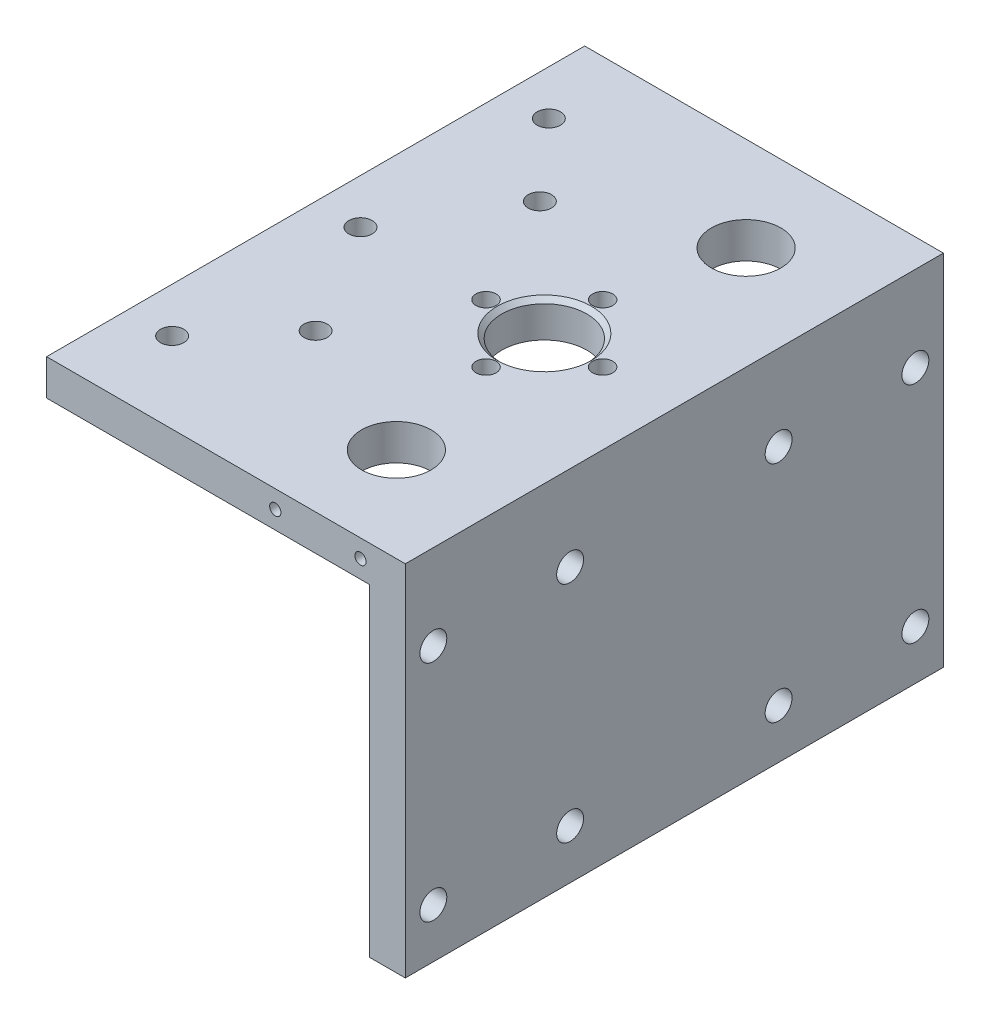
ISO-10303-21;
HEADER;
FILE_DESCRIPTION(('STEP AP214'),'2;1');
FILE_NAME('part.step','',(''),(''),'','','');
FILE_SCHEMA(('AUTOMOTIVE_DESIGN { 1 0 10303 214 1 1 1 1 }'));
ENDSEC;
DATA;
#1=APPLICATION_CONTEXT('core data for automotive mechanical design processes');
#2=APPLICATION_PROTOCOL_DEFINITION('international standard','automotive_design',2000,#1);
#3=PRODUCT_CONTEXT('',#1,'mechanical');
#4=PRODUCT('Part','Part','',(#3));
#5=PRODUCT_RELATED_PRODUCT_CATEGORY('part','',(#4));
#6=PRODUCT_DEFINITION_FORMATION('','',#4);
#7=PRODUCT_DEFINITION_CONTEXT('part definition',#1,'design');
#8=PRODUCT_DEFINITION('design','',#6,#7);
#9=PRODUCT_DEFINITION_SHAPE('','',#8);
#10=(LENGTH_UNIT() NAMED_UNIT(*) SI_UNIT(.MILLI.,.METRE.));
#11=(NAMED_UNIT(*) PLANE_ANGLE_UNIT() SI_UNIT($,.RADIAN.));
#12=(NAMED_UNIT(*) SI_UNIT($,.STERADIAN.) SOLID_ANGLE_UNIT());
#13=UNCERTAINTY_MEASURE_WITH_UNIT(LENGTH_MEASURE(1.E-05),#10,'distance_accuracy_value','');
#14=(GEOMETRIC_REPRESENTATION_CONTEXT(3) GLOBAL_UNCERTAINTY_ASSIGNED_CONTEXT((#13)) GLOBAL_UNIT_ASSIGNED_CONTEXT((#10,
#11,#12)) REPRESENTATION_CONTEXT('',''));
#15=CARTESIAN_POINT('',(0.,0.,0.));
#16=DIRECTION('',(0.,0.,1.));
#17=DIRECTION('',(1.,0.,0.));
#18=AXIS2_PLACEMENT_3D('',#15,#16,#17);
#19=CARTESIAN_POINT('',(0.,-80.,120.));
#20=DIRECTION('',(-1.,0.,0.));
#21=DIRECTION('',(0.,0.,1.));
#22=AXIS2_PLACEMENT_3D('',#19,#20,#21);
#23=PLANE('',#22);
#24=CARTESIAN_POINT('',(0.,-69.,36.75));
#25=DIRECTION('',(1.,0.,0.));
#26=DIRECTION('',(0.,0.,1.));
#27=AXIS2_PLACEMENT_3D('',#24,#25,#26);
#28=CIRCLE('',#27,3.);
#29=CARTESIAN_POINT('',(0.,-69.,39.75));
#30=VERTEX_POINT('',#29);
#31=EDGE_CURVE('E178',#30,#30,#28,.T.);
#32=ORIENTED_EDGE('',*,*,#31,.F.);
#33=EDGE_LOOP('',(#32));
#34=FACE_BOUND('',#33,.T.);
#35=CARTESIAN_POINT('',(0.,-69.,6.25));
#36=DIRECTION('',(1.,0.,0.));
#37=DIRECTION('',(0.,0.,-1.));
#38=AXIS2_PLACEMENT_3D('',#35,#36,#37);
#39=CIRCLE('',#38,3.);
#40=CARTESIAN_POINT('',(0.,-69.,3.25));
#41=VERTEX_POINT('',#40);
#42=EDGE_CURVE('E174',#41,#41,#39,.T.);
#43=ORIENTED_EDGE('',*,*,#42,.F.);
#44=EDGE_LOOP('',(#43));
#45=FACE_BOUND('',#44,.T.);
#46=CARTESIAN_POINT('',(0.,-69.,113.75));
#47=DIRECTION('',(1.,0.,0.));
#48=DIRECTION('',(0.,0.,1.));
#49=AXIS2_PLACEMENT_3D('',#46,#47,#48);
#50=CIRCLE('',#49,3.00000000000001);
#51=CARTESIAN_POINT('',(0.,-69.,116.75));
#52=VERTEX_POINT('',#51);
#53=EDGE_CURVE('E170',#52,#52,#50,.T.);
#54=ORIENTED_EDGE('',*,*,#53,.F.);
#55=EDGE_LOOP('',(#54));
#56=FACE_BOUND('',#55,.T.);
#57=CARTESIAN_POINT('',(0.,-69.,83.25));
#58=DIRECTION('',(1.,0.,0.));
#59=DIRECTION('',(0.,0.,-1.));
#60=AXIS2_PLACEMENT_3D('',#57,#58,#59);
#61=CIRCLE('',#60,3.00000000000001);
#62=CARTESIAN_POINT('',(0.,-69.,80.25));
#63=VERTEX_POINT('',#62);
#64=EDGE_CURVE('E166',#63,#63,#61,.T.);
#65=ORIENTED_EDGE('',*,*,#64,.F.);
#66=EDGE_LOOP('',(#65));
#67=FACE_BOUND('',#66,.T.);
#68=CARTESIAN_POINT('',(0.,-19.,6.25));
#69=DIRECTION('',(1.,0.,0.));
#70=DIRECTION('',(0.,0.,1.));
#71=AXIS2_PLACEMENT_3D('',#68,#69,#70);
#72=CIRCLE('',#71,3.);
#73=CARTESIAN_POINT('',(0.,-19.,9.25));
#74=VERTEX_POINT('',#73);
#75=EDGE_CURVE('E162',#74,#74,#72,.T.);
#76=ORIENTED_EDGE('',*,*,#75,.F.);
#77=EDGE_LOOP('',(#76));
#78=FACE_BOUND('',#77,.T.);
#79=CARTESIAN_POINT('',(0.,-19.,36.75));
#80=DIRECTION('',(1.,0.,0.));
#81=DIRECTION('',(0.,0.,-1.));
#82=AXIS2_PLACEMENT_3D('',#79,#80,#81);
#83=CIRCLE('',#82,3.);
#84=CARTESIAN_POINT('',(0.,-19.,33.75));
#85=VERTEX_POINT('',#84);
#86=EDGE_CURVE('E158',#85,#85,#83,.T.);
#87=ORIENTED_EDGE('',*,*,#86,.F.);
#88=EDGE_LOOP('',(#87));
#89=FACE_BOUND('',#88,.T.);
#90=CARTESIAN_POINT('',(0.,-19.,113.75));
#91=DIRECTION('',(1.,0.,0.));
#92=DIRECTION('',(0.,0.,-1.));
#93=AXIS2_PLACEMENT_3D('',#90,#91,#92);
#94=CIRCLE('',#93,3.00000000000001);
#95=CARTESIAN_POINT('',(0.,-19.,110.75));
#96=VERTEX_POINT('',#95);
#97=EDGE_CURVE('E154',#96,#96,#94,.T.);
#98=ORIENTED_EDGE('',*,*,#97,.F.);
#99=EDGE_LOOP('',(#98));
#100=FACE_BOUND('',#99,.T.);
#101=CARTESIAN_POINT('',(0.,-19.,83.25));
#102=DIRECTION('',(1.,0.,0.));
#103=DIRECTION('',(0.,0.,1.));
#104=AXIS2_PLACEMENT_3D('',#101,#102,#103);
#105=CIRCLE('',#104,3.00000000000001);
#106=CARTESIAN_POINT('',(0.,-19.,86.25));
#107=VERTEX_POINT('',#106);
#108=EDGE_CURVE('E150',#107,#107,#105,.T.);
#109=ORIENTED_EDGE('',*,*,#108,.F.);
#110=EDGE_LOOP('',(#109));
#111=FACE_BOUND('',#110,.T.);
#112=DIRECTION('',(0.,1.,0.));
#113=VECTOR('',#112,1.);
#114=CARTESIAN_POINT('',(0.,-80.,0.));
#115=LINE('',#114,#113);
#116=CARTESIAN_POINT('',(0.,-80.,0.));
#117=VERTEX_POINT('',#116);
#118=CARTESIAN_POINT('',(0.,0.,0.));
#119=VERTEX_POINT('',#118);
#120=EDGE_CURVE('E126',#117,#119,#115,.T.);
#121=ORIENTED_EDGE('',*,*,#120,.T.);
#122=DIRECTION('',(0.,0.,-1.));
#123=VECTOR('',#122,1.);
#124=CARTESIAN_POINT('',(0.,0.,120.));
#125=LINE('',#124,#123);
#126=CARTESIAN_POINT('',(0.,0.,120.));
#127=VERTEX_POINT('',#126);
#128=EDGE_CURVE('E144',#127,#119,#125,.T.);
#129=ORIENTED_EDGE('',*,*,#128,.F.);
#130=DIRECTION('',(0.,1.,0.));
#131=VECTOR('',#130,1.);
#132=CARTESIAN_POINT('',(0.,-80.,120.));
#133=LINE('',#132,#131);
#134=CARTESIAN_POINT('',(0.,-80.,120.));
#135=VERTEX_POINT('',#134);
#136=EDGE_CURVE('E137',#135,#127,#133,.T.);
#137=ORIENTED_EDGE('',*,*,#136,.F.);
#138=DIRECTION('',(0.,0.,-1.));
#139=VECTOR('',#138,1.);
#140=CARTESIAN_POINT('',(0.,-80.,120.));
#141=LINE('',#140,#139);
#142=EDGE_CURVE('E122',#135,#117,#141,.T.);
#143=ORIENTED_EDGE('',*,*,#142,.T.);
#144=EDGE_LOOP('',(#121,#129,#137,#143));
#145=FACE_BOUND('',#144,.T.);
#146=ADVANCED_FACE('F37',(#34,#45,#56,#67,#78,#89,#100,#111,#145),#23,.F.);
#147=CARTESIAN_POINT('',(0.,0.,120.));
#148=DIRECTION('',(0.,-1.,0.));
#149=DIRECTION('',(1.,0.,0.));
#150=AXIS2_PLACEMENT_3D('',#147,#148,#149);
#151=PLANE('',#150);
#152=CARTESIAN_POINT('',(-29.,0.,60.));
#153=DIRECTION('',(0.,-1.,0.));
#154=DIRECTION('',(1.,0.,0.));
#155=AXIS2_PLACEMENT_3D('',#152,#153,#154);
#156=CIRCLE('',#155,10.5);
#157=CARTESIAN_POINT('',(-18.5,0.,60.));
#158=VERTEX_POINT('',#157);
#159=EDGE_CURVE('E11',#158,#158,#156,.T.);
#160=ORIENTED_EDGE('',*,*,#159,.T.);
#161=EDGE_LOOP('',(#160));
#162=FACE_BOUND('',#161,.T.);
#163=CARTESIAN_POINT('',(-55.,0.,85.));
#164=DIRECTION('',(0.,1.,0.));
#165=DIRECTION('',(-1.,0.,0.));
#166=AXIS2_PLACEMENT_3D('',#163,#164,#165);
#167=CIRCLE('',#166,2.6);
#168=CARTESIAN_POINT('',(-57.6,0.,85.));
#169=VERTEX_POINT('',#168);
#170=EDGE_CURVE('E197',#169,#169,#167,.T.);
#171=ORIENTED_EDGE('',*,*,#170,.F.);
#172=EDGE_LOOP('',(#171));
#173=FACE_BOUND('',#172,.T.);
#174=CARTESIAN_POINT('',(-55.,0.,35.));
#175=DIRECTION('',(0.,1.,0.));
#176=DIRECTION('',(-1.,0.,0.));
#177=AXIS2_PLACEMENT_3D('',#174,#175,#176);
#178=CIRCLE('',#177,2.6);
#179=CARTESIAN_POINT('',(-57.6,0.,35.));
#180=VERTEX_POINT('',#179);
#181=EDGE_CURVE('E194',#180,#180,#178,.T.);
#182=ORIENTED_EDGE('',*,*,#181,.F.);
#183=EDGE_LOOP('',(#182));
#184=FACE_BOUND('',#183,.T.);
#185=CARTESIAN_POINT('',(-70.,0.,102.));
#186=DIRECTION('',(0.,1.,0.));
#187=DIRECTION('',(-1.,0.,0.));
#188=AXIS2_PLACEMENT_3D('',#185,#186,#187);
#189=CIRCLE('',#188,2.6);
#190=CARTESIAN_POINT('',(-72.6,0.,102.));
#191=VERTEX_POINT('',#190);
#192=EDGE_CURVE('E190',#191,#191,#189,.T.);
#193=ORIENTED_EDGE('',*,*,#192,.F.);
#194=EDGE_LOOP('',(#193));
#195=FACE_BOUND('',#194,.T.);
#196=CARTESIAN_POINT('',(-70.,0.,60.));
#197=DIRECTION('',(0.,1.,0.));
#198=DIRECTION('',(-1.,0.,0.));
#199=AXIS2_PLACEMENT_3D('',#196,#197,#198);
#200=CIRCLE('',#199,2.6);
#201=CARTESIAN_POINT('',(-72.6,0.,60.));
#202=VERTEX_POINT('',#201);
#203=EDGE_CURVE('E186',#202,#202,#200,.T.);
#204=ORIENTED_EDGE('',*,*,#203,.F.);
#205=EDGE_LOOP('',(#204));
#206=FACE_BOUND('',#205,.T.);
#207=CARTESIAN_POINT('',(-70.,0.,18.));
#208=DIRECTION('',(0.,1.,0.));
#209=DIRECTION('',(-1.,0.,0.));
#210=AXIS2_PLACEMENT_3D('',#207,#208,#209);
#211=CIRCLE('',#210,2.6);
#212=CARTESIAN_POINT('',(-72.6,0.,18.));
#213=VERTEX_POINT('',#212);
#214=EDGE_CURVE('E182',#213,#213,#211,.T.);
#215=ORIENTED_EDGE('',*,*,#214,.F.);
#216=EDGE_LOOP('',(#215));
#217=FACE_BOUND('',#216,.T.);
#218=CARTESIAN_POINT('',(-29.,0.,47.));
#219=DIRECTION('',(0.,1.,0.));
#220=DIRECTION('',(0.,0.,1.));
#221=AXIS2_PLACEMENT_3D('',#218,#219,#220);
#222=CIRCLE('',#221,2.24999999999999);
#223=CARTESIAN_POINT('',(-29.,0.,49.25));
#224=VERTEX_POINT('',#223);
#225=EDGE_CURVE('E149',#224,#224,#222,.T.);
#226=ORIENTED_EDGE('',*,*,#225,.F.);
#227=EDGE_LOOP('',(#226));
#228=FACE_BOUND('',#227,.T.);
#229=CARTESIAN_POINT('',(-42.,0.,60.));
#230=DIRECTION('',(0.,1.,0.));
#231=DIRECTION('',(0.,0.,1.));
#232=AXIS2_PLACEMENT_3D('',#229,#230,#231);
#233=CIRCLE('',#232,2.24999999999999);
#234=CARTESIAN_POINT('',(-42.,0.,62.25));
#235=VERTEX_POINT('',#234);
#236=EDGE_CURVE('E382',#235,#235,#233,.T.);
#237=ORIENTED_EDGE('',*,*,#236,.F.);
#238=EDGE_LOOP('',(#237));
#239=FACE_BOUND('',#238,.T.);
#240=CARTESIAN_POINT('',(-29.,0.,73.));
#241=DIRECTION('',(0.,1.,0.));
#242=DIRECTION('',(0.,0.,1.));
#243=AXIS2_PLACEMENT_3D('',#240,#241,#242);
#244=CIRCLE('',#243,2.24999999999999);
#245=CARTESIAN_POINT('',(-29.,0.,75.25));
#246=VERTEX_POINT('',#245);
#247=EDGE_CURVE('E388',#246,#246,#244,.T.);
#248=ORIENTED_EDGE('',*,*,#247,.F.);
#249=EDGE_LOOP('',(#248));
#250=FACE_BOUND('',#249,.T.);
#251=CARTESIAN_POINT('',(-16.,0.,60.));
#252=DIRECTION('',(0.,1.,0.));
#253=DIRECTION('',(0.,0.,1.));
#254=AXIS2_PLACEMENT_3D('',#251,#252,#253);
#255=CIRCLE('',#254,2.24999999999999);
#256=CARTESIAN_POINT('',(-16.,0.,62.25));
#257=VERTEX_POINT('',#256);
#258=EDGE_CURVE('E394',#257,#257,#255,.T.);
#259=ORIENTED_EDGE('',*,*,#258,.F.);
#260=EDGE_LOOP('',(#259));
#261=FACE_BOUND('',#260,.T.);
#262=CARTESIAN_POINT('',(-23.,0.,99.));
#263=DIRECTION('',(0.,1.,0.));
#264=DIRECTION('',(-1.,0.,0.));
#265=AXIS2_PLACEMENT_3D('',#262,#263,#264);
#266=CIRCLE('',#265,7.75000000000001);
#267=CARTESIAN_POINT('',(-30.75,0.,99.));
#268=VERTEX_POINT('',#267);
#269=EDGE_CURVE('E403',#268,#268,#266,.T.);
#270=ORIENTED_EDGE('',*,*,#269,.F.);
#271=EDGE_LOOP('',(#270));
#272=FACE_BOUND('',#271,.T.);
#273=CARTESIAN_POINT('',(-23.,0.,21.));
#274=DIRECTION('',(0.,1.,0.));
#275=DIRECTION('',(-1.,0.,0.));
#276=AXIS2_PLACEMENT_3D('',#273,#274,#275);
#277=CIRCLE('',#276,7.75);
#278=CARTESIAN_POINT('',(-30.75,0.,21.));
#279=VERTEX_POINT('',#278);
#280=EDGE_CURVE('E409',#279,#279,#277,.T.);
#281=ORIENTED_EDGE('',*,*,#280,.F.);
#282=EDGE_LOOP('',(#281));
#283=FACE_BOUND('',#282,.T.);
#284=DIRECTION('',(-1.,0.,0.));
#285=VECTOR('',#284,1.);
#286=CARTESIAN_POINT('',(0.,0.,0.));
#287=LINE('',#286,#285);
#288=CARTESIAN_POINT('',(-80.,0.,0.));
#289=VERTEX_POINT('',#288);
#290=EDGE_CURVE('E129',#119,#289,#287,.T.);
#291=ORIENTED_EDGE('',*,*,#290,.T.);
#292=DIRECTION('',(0.,0.,-1.));
#293=VECTOR('',#292,1.);
#294=CARTESIAN_POINT('',(-80.,0.,120.));
#295=LINE('',#294,#293);
#296=CARTESIAN_POINT('',(-80.,0.,120.));
#297=VERTEX_POINT('',#296);
#298=EDGE_CURVE('E141',#297,#289,#295,.T.);
#299=ORIENTED_EDGE('',*,*,#298,.F.);
#300=DIRECTION('',(-1.,0.,0.));
#301=VECTOR('',#300,1.);
#302=CARTESIAN_POINT('',(0.,0.,120.));
#303=LINE('',#302,#301);
#304=EDGE_CURVE('E93',#127,#297,#303,.T.);
#305=ORIENTED_EDGE('',*,*,#304,.F.);
#306=ORIENTED_EDGE('',*,*,#128,.T.);
#307=EDGE_LOOP('',(#291,#299,#305,#306));
#308=FACE_BOUND('',#307,.T.);
#309=ADVANCED_FACE('F220',(#162,#173,#184,#195,#206,#217,#228,#239,#250,#261,#272,#283,#308),
#151,.F.);
#310=CARTESIAN_POINT('',(-80.,0.,120.));
#311=DIRECTION('',(1.,0.,0.));
#312=DIRECTION('',(0.,0.,-1.));
#313=AXIS2_PLACEMENT_3D('',#310,#311,#312);
#314=PLANE('',#313);
#315=DIRECTION('',(0.,-1.,0.));
#316=VECTOR('',#315,1.);
#317=CARTESIAN_POINT('',(-80.,0.,0.));
#318=LINE('',#317,#316);
#319=CARTESIAN_POINT('',(-80.,-8.00000000000001,0.));
#320=VERTEX_POINT('',#319);
#321=EDGE_CURVE('E132',#289,#320,#318,.T.);
#322=ORIENTED_EDGE('',*,*,#321,.T.);
#323=DIRECTION('',(0.,0.,-1.));
#324=VECTOR('',#323,1.);
#325=CARTESIAN_POINT('',(-80.,-8.00000000000001,120.));
#326=LINE('',#325,#324);
#327=CARTESIAN_POINT('',(-80.,-8.00000000000001,120.));
#328=VERTEX_POINT('',#327);
#329=EDGE_CURVE('E117',#328,#320,#326,.T.);
#330=ORIENTED_EDGE('',*,*,#329,.F.);
#331=DIRECTION('',(0.,-1.,0.));
#332=VECTOR('',#331,1.);
#333=CARTESIAN_POINT('',(-80.,0.,120.));
#334=LINE('',#333,#332);
#335=EDGE_CURVE('E108',#297,#328,#334,.T.);
#336=ORIENTED_EDGE('',*,*,#335,.F.);
#337=ORIENTED_EDGE('',*,*,#298,.T.);
#338=EDGE_LOOP('',(#322,#330,#336,#337));
#339=FACE_BOUND('',#338,.T.);
#340=ADVANCED_FACE('F225',(#339),#314,.F.);
#341=CARTESIAN_POINT('',(-80.,-8.00000000000001,120.));
#342=DIRECTION('',(0.,1.,0.));
#343=DIRECTION('',(0.,0.,1.));
#344=AXIS2_PLACEMENT_3D('',#341,#342,#343);
#345=PLANE('',#344);
#346=CARTESIAN_POINT('',(-55.,-8.00000000000001,85.));
#347=DIRECTION('',(0.,1.,0.));
#348=DIRECTION('',(0.,0.,1.));
#349=AXIS2_PLACEMENT_3D('',#346,#347,#348);
#350=CIRCLE('',#349,2.6);
#351=CARTESIAN_POINT('',(-55.,-8.00000000000001,87.6));
#352=VERTEX_POINT('',#351);
#353=EDGE_CURVE('E195',#352,#352,#350,.T.);
#354=ORIENTED_EDGE('',*,*,#353,.T.);
#355=EDGE_LOOP('',(#354));
#356=FACE_BOUND('',#355,.T.);
#357=CARTESIAN_POINT('',(-55.,-8.00000000000001,35.));
#358=DIRECTION('',(0.,1.,0.));
#359=DIRECTION('',(0.,0.,1.));
#360=AXIS2_PLACEMENT_3D('',#357,#358,#359);
#361=CIRCLE('',#360,2.6);
#362=CARTESIAN_POINT('',(-55.,-8.00000000000001,37.6));
#363=VERTEX_POINT('',#362);
#364=EDGE_CURVE('E191',#363,#363,#361,.T.);
#365=ORIENTED_EDGE('',*,*,#364,.T.);
#366=EDGE_LOOP('',(#365));
#367=FACE_BOUND('',#366,.T.);
#368=CARTESIAN_POINT('',(-70.,-8.00000000000001,102.));
#369=DIRECTION('',(0.,1.,0.));
#370=DIRECTION('',(0.,0.,1.));
#371=AXIS2_PLACEMENT_3D('',#368,#369,#370);
#372=CIRCLE('',#371,2.6);
#373=CARTESIAN_POINT('',(-70.,-8.00000000000001,104.6));
#374=VERTEX_POINT('',#373);
#375=EDGE_CURVE('E187',#374,#374,#372,.T.);
#376=ORIENTED_EDGE('',*,*,#375,.T.);
#377=EDGE_LOOP('',(#376));
#378=FACE_BOUND('',#377,.T.);
#379=CARTESIAN_POINT('',(-70.,-8.00000000000001,60.));
#380=DIRECTION('',(0.,1.,0.));
#381=DIRECTION('',(0.,0.,1.));
#382=AXIS2_PLACEMENT_3D('',#379,#380,#381);
#383=CIRCLE('',#382,2.6);
#384=CARTESIAN_POINT('',(-70.,-8.00000000000001,62.6));
#385=VERTEX_POINT('',#384);
#386=EDGE_CURVE('E183',#385,#385,#383,.T.);
#387=ORIENTED_EDGE('',*,*,#386,.T.);
#388=EDGE_LOOP('',(#387));
#389=FACE_BOUND('',#388,.T.);
#390=CARTESIAN_POINT('',(-70.,-8.00000000000001,18.));
#391=DIRECTION('',(0.,1.,0.));
#392=DIRECTION('',(0.,0.,1.));
#393=AXIS2_PLACEMENT_3D('',#390,#391,#392);
#394=CIRCLE('',#393,2.6);
#395=CARTESIAN_POINT('',(-70.,-8.00000000000001,20.6));
#396=VERTEX_POINT('',#395);
#397=EDGE_CURVE('E179',#396,#396,#394,.T.);
#398=ORIENTED_EDGE('',*,*,#397,.T.);
#399=EDGE_LOOP('',(#398));
#400=FACE_BOUND('',#399,.T.);
#401=CARTESIAN_POINT('',(-29.,-8.00000000000001,47.));
#402=DIRECTION('',(0.,1.,0.));
#403=DIRECTION('',(0.,0.,1.));
#404=AXIS2_PLACEMENT_3D('',#401,#402,#403);
#405=CIRCLE('',#404,2.24999999999999);
#406=CARTESIAN_POINT('',(-29.,-8.00000000000001,49.25));
#407=VERTEX_POINT('',#406);
#408=EDGE_CURVE('E379',#407,#407,#405,.T.);
#409=ORIENTED_EDGE('',*,*,#408,.T.);
#410=EDGE_LOOP('',(#409));
#411=FACE_BOUND('',#410,.T.);
#412=CARTESIAN_POINT('',(-42.,-8.00000000000001,60.));
#413=DIRECTION('',(0.,1.,0.));
#414=DIRECTION('',(0.,0.,1.));
#415=AXIS2_PLACEMENT_3D('',#412,#413,#414);
#416=CIRCLE('',#415,2.24999999999999);
#417=CARTESIAN_POINT('',(-42.,-8.00000000000001,62.25));
#418=VERTEX_POINT('',#417);
#419=EDGE_CURVE('E385',#418,#418,#416,.T.);
#420=ORIENTED_EDGE('',*,*,#419,.T.);
#421=EDGE_LOOP('',(#420));
#422=FACE_BOUND('',#421,.T.);
#423=CARTESIAN_POINT('',(-29.,-8.00000000000001,73.));
#424=DIRECTION('',(0.,1.,0.));
#425=DIRECTION('',(0.,0.,1.));
#426=AXIS2_PLACEMENT_3D('',#423,#424,#425);
#427=CIRCLE('',#426,2.24999999999999);
#428=CARTESIAN_POINT('',(-29.,-8.00000000000001,75.25));
#429=VERTEX_POINT('',#428);
#430=EDGE_CURVE('E391',#429,#429,#427,.T.);
#431=ORIENTED_EDGE('',*,*,#430,.T.);
#432=EDGE_LOOP('',(#431));
#433=FACE_BOUND('',#432,.T.);
#434=CARTESIAN_POINT('',(-16.,-8.00000000000001,60.));
#435=DIRECTION('',(0.,1.,0.));
#436=DIRECTION('',(0.,0.,1.));
#437=AXIS2_PLACEMENT_3D('',#434,#435,#436);
#438=CIRCLE('',#437,2.24999999999999);
#439=CARTESIAN_POINT('',(-16.,-8.00000000000001,62.25));
#440=VERTEX_POINT('',#439);
#441=EDGE_CURVE('E397',#440,#440,#438,.T.);
#442=ORIENTED_EDGE('',*,*,#441,.T.);
#443=EDGE_LOOP('',(#442));
#444=FACE_BOUND('',#443,.T.);
#445=CARTESIAN_POINT('',(-29.,-8.00000000000001,60.));
#446=DIRECTION('',(0.,1.,0.));
#447=DIRECTION('',(0.,0.,1.));
#448=AXIS2_PLACEMENT_3D('',#445,#446,#447);
#449=CIRCLE('',#448,9.5);
#450=CARTESIAN_POINT('',(-29.,-8.00000000000001,69.5));
#451=VERTEX_POINT('',#450);
#452=EDGE_CURVE('E400',#451,#451,#449,.F.);
#453=ORIENTED_EDGE('',*,*,#452,.F.);
#454=EDGE_LOOP('',(#453));
#455=FACE_BOUND('',#454,.T.);
#456=CARTESIAN_POINT('',(-23.,-8.00000000000001,99.));
#457=DIRECTION('',(0.,1.,0.));
#458=DIRECTION('',(0.,0.,1.));
#459=AXIS2_PLACEMENT_3D('',#456,#457,#458);
#460=CIRCLE('',#459,7.75000000000001);
#461=CARTESIAN_POINT('',(-23.,-8.00000000000001,106.75));
#462=VERTEX_POINT('',#461);
#463=EDGE_CURVE('E406',#462,#462,#460,.F.);
#464=ORIENTED_EDGE('',*,*,#463,.F.);
#465=EDGE_LOOP('',(#464));
#466=FACE_BOUND('',#465,.T.);
#467=CARTESIAN_POINT('',(-23.,-8.00000000000001,21.));
#468=DIRECTION('',(0.,1.,0.));
#469=DIRECTION('',(0.,0.,1.));
#470=AXIS2_PLACEMENT_3D('',#467,#468,#469);
#471=CIRCLE('',#470,7.75);
#472=CARTESIAN_POINT('',(-23.,-8.00000000000001,28.75));
#473=VERTEX_POINT('',#472);
#474=EDGE_CURVE('E130',#473,#473,#471,.F.);
#475=ORIENTED_EDGE('',*,*,#474,.F.);
#476=EDGE_LOOP('',(#475));
#477=FACE_BOUND('',#476,.T.);
#478=DIRECTION('',(1.,0.,0.));
#479=VECTOR('',#478,1.);
#480=CARTESIAN_POINT('',(-80.,-8.00000000000001,0.));
#481=LINE('',#480,#479);
#482=CARTESIAN_POINT('',(-8.00000000000001,-8.00000000000001,0.));
#483=VERTEX_POINT('',#482);
#484=EDGE_CURVE('E116',#320,#483,#481,.T.);
#485=ORIENTED_EDGE('',*,*,#484,.T.);
#486=DIRECTION('',(0.,0.,-1.));
#487=VECTOR('',#486,1.);
#488=CARTESIAN_POINT('',(-8.00000000000001,-8.00000000000001,120.));
#489=LINE('',#488,#487);
#490=CARTESIAN_POINT('',(-8.00000000000001,-8.00000000000001,120.));
#491=VERTEX_POINT('',#490);
#492=EDGE_CURVE('E113',#491,#483,#489,.T.);
#493=ORIENTED_EDGE('',*,*,#492,.F.);
#494=DIRECTION('',(1.,0.,0.));
#495=VECTOR('',#494,1.);
#496=CARTESIAN_POINT('',(-80.,-8.00000000000001,120.));
#497=LINE('',#496,#495);
#498=EDGE_CURVE('E102',#328,#491,#497,.T.);
#499=ORIENTED_EDGE('',*,*,#498,.F.);
#500=ORIENTED_EDGE('',*,*,#329,.T.);
#501=EDGE_LOOP('',(#485,#493,#499,#500));
#502=FACE_BOUND('',#501,.T.);
#503=ADVANCED_FACE('F114',(#356,#367,#378,#389,#400,#411,#422,#433,#444,#455,#466,#477,#502),
#345,.F.);
#504=CARTESIAN_POINT('',(-8.00000000000001,-8.00000000000001,120.));
#505=DIRECTION('',(1.,0.,0.));
#506=DIRECTION('',(0.,1.,0.));
#507=AXIS2_PLACEMENT_3D('',#504,#505,#506);
#508=PLANE('',#507);
#509=CARTESIAN_POINT('',(-8.,-69.,36.75));
#510=DIRECTION('',(1.,0.,0.));
#511=DIRECTION('',(0.,1.,0.));
#512=AXIS2_PLACEMENT_3D('',#509,#510,#511);
#513=CIRCLE('',#512,3.);
#514=CARTESIAN_POINT('',(-8.,-66.,36.75));
#515=VERTEX_POINT('',#514);
#516=EDGE_CURVE('E175',#515,#515,#513,.T.);
#517=ORIENTED_EDGE('',*,*,#516,.T.);
#518=EDGE_LOOP('',(#517));
#519=FACE_BOUND('',#518,.T.);
#520=CARTESIAN_POINT('',(-8.,-69.,6.25));
#521=DIRECTION('',(1.,0.,0.));
#522=DIRECTION('',(0.,1.,0.));
#523=AXIS2_PLACEMENT_3D('',#520,#521,#522);
#524=CIRCLE('',#523,3.);
#525=CARTESIAN_POINT('',(-8.,-66.,6.25));
#526=VERTEX_POINT('',#525);
#527=EDGE_CURVE('E171',#526,#526,#524,.T.);
#528=ORIENTED_EDGE('',*,*,#527,.T.);
#529=EDGE_LOOP('',(#528));
#530=FACE_BOUND('',#529,.T.);
#531=CARTESIAN_POINT('',(-8.,-69.,113.75));
#532=DIRECTION('',(1.,0.,0.));
#533=DIRECTION('',(0.,1.,0.));
#534=AXIS2_PLACEMENT_3D('',#531,#532,#533);
#535=CIRCLE('',#534,3.00000000000001);
#536=CARTESIAN_POINT('',(-8.,-66.,113.75));
#537=VERTEX_POINT('',#536);
#538=EDGE_CURVE('E167',#537,#537,#535,.T.);
#539=ORIENTED_EDGE('',*,*,#538,.T.);
#540=EDGE_LOOP('',(#539));
#541=FACE_BOUND('',#540,.T.);
#542=CARTESIAN_POINT('',(-8.,-69.,83.25));
#543=DIRECTION('',(1.,0.,0.));
#544=DIRECTION('',(0.,1.,0.));
#545=AXIS2_PLACEMENT_3D('',#542,#543,#544);
#546=CIRCLE('',#545,3.00000000000001);
#547=CARTESIAN_POINT('',(-8.,-66.,83.25));
#548=VERTEX_POINT('',#547);
#549=EDGE_CURVE('E163',#548,#548,#546,.T.);
#550=ORIENTED_EDGE('',*,*,#549,.T.);
#551=EDGE_LOOP('',(#550));
#552=FACE_BOUND('',#551,.T.);
#553=CARTESIAN_POINT('',(-8.00000000000001,-19.,6.25));
#554=DIRECTION('',(1.,0.,0.));
#555=DIRECTION('',(0.,1.,0.));
#556=AXIS2_PLACEMENT_3D('',#553,#554,#555);
#557=CIRCLE('',#556,3.);
#558=CARTESIAN_POINT('',(-8.00000000000001,-16.,6.25));
#559=VERTEX_POINT('',#558);
#560=EDGE_CURVE('E159',#559,#559,#557,.T.);
#561=ORIENTED_EDGE('',*,*,#560,.T.);
#562=EDGE_LOOP('',(#561));
#563=FACE_BOUND('',#562,.T.);
#564=CARTESIAN_POINT('',(-8.00000000000001,-19.,36.75));
#565=DIRECTION('',(1.,0.,0.));
#566=DIRECTION('',(0.,1.,0.));
#567=AXIS2_PLACEMENT_3D('',#564,#565,#566);
#568=CIRCLE('',#567,3.);
#569=CARTESIAN_POINT('',(-8.00000000000001,-16.,36.75));
#570=VERTEX_POINT('',#569);
#571=EDGE_CURVE('E155',#570,#570,#568,.T.);
#572=ORIENTED_EDGE('',*,*,#571,.T.);
#573=EDGE_LOOP('',(#572));
#574=FACE_BOUND('',#573,.T.);
#575=CARTESIAN_POINT('',(-8.00000000000001,-19.,113.75));
#576=DIRECTION('',(1.,0.,0.));
#577=DIRECTION('',(0.,1.,0.));
#578=AXIS2_PLACEMENT_3D('',#575,#576,#577);
#579=CIRCLE('',#578,3.00000000000001);
#580=CARTESIAN_POINT('',(-8.00000000000001,-16.,113.75));
#581=VERTEX_POINT('',#580);
#582=EDGE_CURVE('E151',#581,#581,#579,.T.);
#583=ORIENTED_EDGE('',*,*,#582,.T.);
#584=EDGE_LOOP('',(#583));
#585=FACE_BOUND('',#584,.T.);
#586=CARTESIAN_POINT('',(-8.00000000000001,-19.,83.25));
#587=DIRECTION('',(1.,0.,0.));
#588=DIRECTION('',(0.,1.,0.));
#589=AXIS2_PLACEMENT_3D('',#586,#587,#588);
#590=CIRCLE('',#589,3.00000000000001);
#591=CARTESIAN_POINT('',(-8.00000000000001,-16.,83.25));
#592=VERTEX_POINT('',#591);
#593=EDGE_CURVE('E146',#592,#592,#590,.T.);
#594=ORIENTED_EDGE('',*,*,#593,.T.);
#595=EDGE_LOOP('',(#594));
#596=FACE_BOUND('',#595,.T.);
#597=DIRECTION('',(0.,-1.,0.));
#598=VECTOR('',#597,1.);
#599=CARTESIAN_POINT('',(-8.00000000000001,-8.00000000000001,0.));
#600=LINE('',#599,#598);
#601=CARTESIAN_POINT('',(-8.,-80.,0.));
#602=VERTEX_POINT('',#601);
#603=EDGE_CURVE('E78',#483,#602,#600,.T.);
#604=ORIENTED_EDGE('',*,*,#603,.T.);
#605=DIRECTION('',(0.,0.,-1.));
#606=VECTOR('',#605,1.);
#607=CARTESIAN_POINT('',(-8.,-80.,120.));
#608=LINE('',#607,#606);
#609=CARTESIAN_POINT('',(-8.,-80.,120.));
#610=VERTEX_POINT('',#609);
#611=EDGE_CURVE('E118',#610,#602,#608,.T.);
#612=ORIENTED_EDGE('',*,*,#611,.F.);
#613=DIRECTION('',(0.,-1.,0.));
#614=VECTOR('',#613,1.);
#615=CARTESIAN_POINT('',(-8.00000000000001,-8.00000000000001,120.));
#616=LINE('',#615,#614);
#617=EDGE_CURVE('E106',#491,#610,#616,.T.);
#618=ORIENTED_EDGE('',*,*,#617,.F.);
#619=ORIENTED_EDGE('',*,*,#492,.T.);
#620=EDGE_LOOP('',(#604,#612,#618,#619));
#621=FACE_BOUND('',#620,.T.);
#622=ADVANCED_FACE('F120',(#519,#530,#541,#552,#563,#574,#585,#596,#621),#508,.F.);
#623=CARTESIAN_POINT('',(-8.,-80.,120.));
#624=DIRECTION('',(0.,1.,0.));
#625=DIRECTION('',(0.,0.,1.));
#626=AXIS2_PLACEMENT_3D('',#623,#624,#625);
#627=PLANE('',#626);
#628=DIRECTION('',(1.,0.,0.));
#629=VECTOR('',#628,1.);
#630=CARTESIAN_POINT('',(-8.,-80.,0.));
#631=LINE('',#630,#629);
#632=EDGE_CURVE('E84',#602,#117,#631,.T.);
#633=ORIENTED_EDGE('',*,*,#632,.T.);
#634=ORIENTED_EDGE('',*,*,#142,.F.);
#635=DIRECTION('',(1.,0.,0.));
#636=VECTOR('',#635,1.);
#637=CARTESIAN_POINT('',(-8.,-80.,120.));
#638=LINE('',#637,#636);
#639=EDGE_CURVE('E54',#610,#135,#638,.T.);
#640=ORIENTED_EDGE('',*,*,#639,.F.);
#641=ORIENTED_EDGE('',*,*,#611,.T.);
#642=EDGE_LOOP('',(#633,#634,#640,#641));
#643=FACE_BOUND('',#642,.T.);
#644=ADVANCED_FACE('F239',(#643),#627,.F.);
#645=CARTESIAN_POINT('',(0.,0.,120.));
#646=DIRECTION('',(0.,0.,1.));
#647=DIRECTION('',(1.,0.,0.));
#648=AXIS2_PLACEMENT_3D('',#645,#646,#647);
#649=PLANE('',#648);
#650=CARTESIAN_POINT('',(-10.,-4.00000000000002,120.));
#651=DIRECTION('',(0.,0.,1.));
#652=DIRECTION('',(1.,0.,0.));
#653=AXIS2_PLACEMENT_3D('',#650,#651,#652);
#654=CIRCLE('',#653,1.25);
#655=CARTESIAN_POINT('',(-8.75,-4.00000000000002,120.));
#656=VERTEX_POINT('',#655);
#657=EDGE_CURVE('E341',#656,#656,#654,.T.);
#658=ORIENTED_EDGE('',*,*,#657,.F.);
#659=EDGE_LOOP('',(#658));
#660=FACE_BOUND('',#659,.T.);
#661=CARTESIAN_POINT('',(-29.,-4.00000000000001,120.));
#662=DIRECTION('',(0.,0.,1.));
#663=DIRECTION('',(1.,0.,0.));
#664=AXIS2_PLACEMENT_3D('',#661,#662,#663);
#665=CIRCLE('',#664,1.25);
#666=CARTESIAN_POINT('',(-27.75,-4.00000000000001,120.));
#667=VERTEX_POINT('',#666);
#668=EDGE_CURVE('E343',#667,#667,#665,.T.);
#669=ORIENTED_EDGE('',*,*,#668,.F.);
#670=EDGE_LOOP('',(#669));
#671=FACE_BOUND('',#670,.T.);
#672=ORIENTED_EDGE('',*,*,#136,.T.);
#673=ORIENTED_EDGE('',*,*,#304,.T.);
#674=ORIENTED_EDGE('',*,*,#335,.T.);
#675=ORIENTED_EDGE('',*,*,#498,.T.);
#676=ORIENTED_EDGE('',*,*,#617,.T.);
#677=ORIENTED_EDGE('',*,*,#639,.T.);
#678=EDGE_LOOP('',(#672,#673,#674,#675,#676,#677));
#679=FACE_BOUND('',#678,.T.);
#680=ADVANCED_FACE('F104',(#660,#671,#679),#649,.T.);
#681=CARTESIAN_POINT('',(0.,0.,0.));
#682=DIRECTION('',(0.,0.,1.));
#683=DIRECTION('',(1.,0.,0.));
#684=AXIS2_PLACEMENT_3D('',#681,#682,#683);
#685=PLANE('',#684);
#686=ORIENTED_EDGE('',*,*,#120,.F.);
#687=ORIENTED_EDGE('',*,*,#632,.F.);
#688=ORIENTED_EDGE('',*,*,#603,.F.);
#689=ORIENTED_EDGE('',*,*,#484,.F.);
#690=ORIENTED_EDGE('',*,*,#321,.F.);
#691=ORIENTED_EDGE('',*,*,#290,.F.);
#692=EDGE_LOOP('',(#686,#687,#688,#689,#690,#691));
#693=FACE_BOUND('',#692,.T.);
#694=ADVANCED_FACE('F243',(#693),#685,.F.);
#695=CARTESIAN_POINT('',(-23.,-80.001,21.));
#696=DIRECTION('',(0.,1.,0.));
#697=DIRECTION('',(-1.,0.,0.));
#698=AXIS2_PLACEMENT_3D('',#695,#696,#697);
#699=CYLINDRICAL_SURFACE('',#698,7.75);
#700=ORIENTED_EDGE('',*,*,#280,.T.);
#701=EDGE_LOOP('',(#700));
#702=FACE_BOUND('',#701,.T.);
#703=ORIENTED_EDGE('',*,*,#474,.T.);
#704=EDGE_LOOP('',(#703));
#705=FACE_BOUND('',#704,.T.);
#706=ADVANCED_FACE('F246',(#702,#705),#699,.F.);
#707=CARTESIAN_POINT('',(-23.,-80.001,99.));
#708=DIRECTION('',(0.,1.,0.));
#709=DIRECTION('',(-1.,0.,0.));
#710=AXIS2_PLACEMENT_3D('',#707,#708,#709);
#711=CYLINDRICAL_SURFACE('',#710,7.75000000000001);
#712=ORIENTED_EDGE('',*,*,#269,.T.);
#713=EDGE_LOOP('',(#712));
#714=FACE_BOUND('',#713,.T.);
#715=ORIENTED_EDGE('',*,*,#463,.T.);
#716=EDGE_LOOP('',(#715));
#717=FACE_BOUND('',#716,.T.);
#718=ADVANCED_FACE('F253',(#714,#717),#711,.F.);
#719=CARTESIAN_POINT('',(-29.,-80.001,60.));
#720=DIRECTION('',(0.,1.,0.));
#721=DIRECTION('',(-1.,0.,0.));
#722=AXIS2_PLACEMENT_3D('',#719,#720,#721);
#723=CYLINDRICAL_SURFACE('',#722,9.5);
#724=CARTESIAN_POINT('',(-29.,-1.00000000000003,60.));
#725=DIRECTION('',(0.,-1.,0.));
#726=DIRECTION('',(0.,0.,-1.));
#727=AXIS2_PLACEMENT_3D('',#724,#725,#726);
#728=CIRCLE('',#727,9.5);
#729=CARTESIAN_POINT('',(-29.,-1.00000000000003,50.5));
#730=VERTEX_POINT('',#729);
#731=EDGE_CURVE('E46',#730,#730,#728,.F.);
#732=ORIENTED_EDGE('',*,*,#731,.T.);
#733=EDGE_LOOP('',(#732));
#734=FACE_BOUND('',#733,.T.);
#735=ORIENTED_EDGE('',*,*,#452,.T.);
#736=EDGE_LOOP('',(#735));
#737=FACE_BOUND('',#736,.T.);
#738=ADVANCED_FACE('F201',(#734,#737),#723,.F.);
#739=CARTESIAN_POINT('',(-16.,0.,60.));
#740=DIRECTION('',(0.,1.,0.));
#741=DIRECTION('',(0.,0.,1.));
#742=AXIS2_PLACEMENT_3D('',#739,#740,#741);
#743=CYLINDRICAL_SURFACE('',#742,2.24999999999999);
#744=ORIENTED_EDGE('',*,*,#258,.T.);
#745=EDGE_LOOP('',(#744));
#746=FACE_BOUND('',#745,.T.);
#747=ORIENTED_EDGE('',*,*,#441,.F.);
#748=EDGE_LOOP('',(#747));
#749=FACE_BOUND('',#748,.T.);
#750=ADVANCED_FACE('F260',(#746,#749),#743,.F.);
#751=CARTESIAN_POINT('',(-29.,0.,73.));
#752=DIRECTION('',(0.,1.,0.));
#753=DIRECTION('',(0.,0.,1.));
#754=AXIS2_PLACEMENT_3D('',#751,#752,#753);
#755=CYLINDRICAL_SURFACE('',#754,2.24999999999999);
#756=ORIENTED_EDGE('',*,*,#247,.T.);
#757=EDGE_LOOP('',(#756));
#758=FACE_BOUND('',#757,.T.);
#759=ORIENTED_EDGE('',*,*,#430,.F.);
#760=EDGE_LOOP('',(#759));
#761=FACE_BOUND('',#760,.T.);
#762=ADVANCED_FACE('F263',(#758,#761),#755,.F.);
#763=CARTESIAN_POINT('',(-42.,0.,60.));
#764=DIRECTION('',(0.,1.,0.));
#765=DIRECTION('',(0.,0.,1.));
#766=AXIS2_PLACEMENT_3D('',#763,#764,#765);
#767=CYLINDRICAL_SURFACE('',#766,2.24999999999999);
#768=ORIENTED_EDGE('',*,*,#236,.T.);
#769=EDGE_LOOP('',(#768));
#770=FACE_BOUND('',#769,.T.);
#771=ORIENTED_EDGE('',*,*,#419,.F.);
#772=EDGE_LOOP('',(#771));
#773=FACE_BOUND('',#772,.T.);
#774=ADVANCED_FACE('F267',(#770,#773),#767,.F.);
#775=CARTESIAN_POINT('',(-29.,0.,47.));
#776=DIRECTION('',(0.,1.,0.));
#777=DIRECTION('',(0.,0.,1.));
#778=AXIS2_PLACEMENT_3D('',#775,#776,#777);
#779=CYLINDRICAL_SURFACE('',#778,2.24999999999999);
#780=ORIENTED_EDGE('',*,*,#225,.T.);
#781=EDGE_LOOP('',(#780));
#782=FACE_BOUND('',#781,.T.);
#783=ORIENTED_EDGE('',*,*,#408,.F.);
#784=EDGE_LOOP('',(#783));
#785=FACE_BOUND('',#784,.T.);
#786=ADVANCED_FACE('F271',(#782,#785),#779,.F.);
#787=CARTESIAN_POINT('',(-10.,-19.,83.25));
#788=DIRECTION('',(1.,0.,0.));
#789=DIRECTION('',(0.,0.,-1.));
#790=AXIS2_PLACEMENT_3D('',#787,#788,#789);
#791=CYLINDRICAL_SURFACE('',#790,3.00000000000001);
#792=ORIENTED_EDGE('',*,*,#108,.T.);
#793=EDGE_LOOP('',(#792));
#794=FACE_BOUND('',#793,.T.);
#795=ORIENTED_EDGE('',*,*,#593,.F.);
#796=EDGE_LOOP('',(#795));
#797=FACE_BOUND('',#796,.T.);
#798=ADVANCED_FACE('F275',(#794,#797),#791,.F.);
#799=CARTESIAN_POINT('',(-10.,-19.,113.75));
#800=DIRECTION('',(1.,0.,0.));
#801=DIRECTION('',(0.,0.,-1.));
#802=AXIS2_PLACEMENT_3D('',#799,#800,#801);
#803=CYLINDRICAL_SURFACE('',#802,3.00000000000001);
#804=ORIENTED_EDGE('',*,*,#97,.T.);
#805=EDGE_LOOP('',(#804));
#806=FACE_BOUND('',#805,.T.);
#807=ORIENTED_EDGE('',*,*,#582,.F.);
#808=EDGE_LOOP('',(#807));
#809=FACE_BOUND('',#808,.T.);
#810=ADVANCED_FACE('F279',(#806,#809),#803,.F.);
#811=CARTESIAN_POINT('',(-10.,-19.,36.75));
#812=DIRECTION('',(1.,0.,0.));
#813=DIRECTION('',(0.,0.,-1.));
#814=AXIS2_PLACEMENT_3D('',#811,#812,#813);
#815=CYLINDRICAL_SURFACE('',#814,3.);
#816=ORIENTED_EDGE('',*,*,#86,.T.);
#817=EDGE_LOOP('',(#816));
#818=FACE_BOUND('',#817,.T.);
#819=ORIENTED_EDGE('',*,*,#571,.F.);
#820=EDGE_LOOP('',(#819));
#821=FACE_BOUND('',#820,.T.);
#822=ADVANCED_FACE('F283',(#818,#821),#815,.F.);
#823=CARTESIAN_POINT('',(-10.,-19.,6.25));
#824=DIRECTION('',(1.,0.,0.));
#825=DIRECTION('',(0.,0.,-1.));
#826=AXIS2_PLACEMENT_3D('',#823,#824,#825);
#827=CYLINDRICAL_SURFACE('',#826,3.);
#828=ORIENTED_EDGE('',*,*,#75,.T.);
#829=EDGE_LOOP('',(#828));
#830=FACE_BOUND('',#829,.T.);
#831=ORIENTED_EDGE('',*,*,#560,.F.);
#832=EDGE_LOOP('',(#831));
#833=FACE_BOUND('',#832,.T.);
#834=ADVANCED_FACE('F287',(#830,#833),#827,.F.);
#835=CARTESIAN_POINT('',(-10.,-69.,83.25));
#836=DIRECTION('',(1.,0.,0.));
#837=DIRECTION('',(0.,0.,-1.));
#838=AXIS2_PLACEMENT_3D('',#835,#836,#837);
#839=CYLINDRICAL_SURFACE('',#838,3.00000000000001);
#840=ORIENTED_EDGE('',*,*,#64,.T.);
#841=EDGE_LOOP('',(#840));
#842=FACE_BOUND('',#841,.T.);
#843=ORIENTED_EDGE('',*,*,#549,.F.);
#844=EDGE_LOOP('',(#843));
#845=FACE_BOUND('',#844,.T.);
#846=ADVANCED_FACE('F291',(#842,#845),#839,.F.);
#847=CARTESIAN_POINT('',(-10.,-69.,113.75));
#848=DIRECTION('',(1.,0.,0.));
#849=DIRECTION('',(0.,0.,-1.));
#850=AXIS2_PLACEMENT_3D('',#847,#848,#849);
#851=CYLINDRICAL_SURFACE('',#850,3.00000000000001);
#852=ORIENTED_EDGE('',*,*,#53,.T.);
#853=EDGE_LOOP('',(#852));
#854=FACE_BOUND('',#853,.T.);
#855=ORIENTED_EDGE('',*,*,#538,.F.);
#856=EDGE_LOOP('',(#855));
#857=FACE_BOUND('',#856,.T.);
#858=ADVANCED_FACE('F295',(#854,#857),#851,.F.);
#859=CARTESIAN_POINT('',(-10.,-69.,6.25));
#860=DIRECTION('',(1.,0.,0.));
#861=DIRECTION('',(0.,0.,-1.));
#862=AXIS2_PLACEMENT_3D('',#859,#860,#861);
#863=CYLINDRICAL_SURFACE('',#862,3.);
#864=ORIENTED_EDGE('',*,*,#42,.T.);
#865=EDGE_LOOP('',(#864));
#866=FACE_BOUND('',#865,.T.);
#867=ORIENTED_EDGE('',*,*,#527,.F.);
#868=EDGE_LOOP('',(#867));
#869=FACE_BOUND('',#868,.T.);
#870=ADVANCED_FACE('F299',(#866,#869),#863,.F.);
#871=CARTESIAN_POINT('',(-10.,-69.,36.75));
#872=DIRECTION('',(1.,0.,0.));
#873=DIRECTION('',(0.,0.,-1.));
#874=AXIS2_PLACEMENT_3D('',#871,#872,#873);
#875=CYLINDRICAL_SURFACE('',#874,3.);
#876=ORIENTED_EDGE('',*,*,#31,.T.);
#877=EDGE_LOOP('',(#876));
#878=FACE_BOUND('',#877,.T.);
#879=ORIENTED_EDGE('',*,*,#516,.F.);
#880=EDGE_LOOP('',(#879));
#881=FACE_BOUND('',#880,.T.);
#882=ADVANCED_FACE('F303',(#878,#881),#875,.F.);
#883=CARTESIAN_POINT('',(-70.,-10.,18.));
#884=DIRECTION('',(0.,1.,0.));
#885=DIRECTION('',(-1.,0.,0.));
#886=AXIS2_PLACEMENT_3D('',#883,#884,#885);
#887=CYLINDRICAL_SURFACE('',#886,2.6);
#888=ORIENTED_EDGE('',*,*,#214,.T.);
#889=EDGE_LOOP('',(#888));
#890=FACE_BOUND('',#889,.T.);
#891=ORIENTED_EDGE('',*,*,#397,.F.);
#892=EDGE_LOOP('',(#891));
#893=FACE_BOUND('',#892,.T.);
#894=ADVANCED_FACE('F307',(#890,#893),#887,.F.);
#895=CARTESIAN_POINT('',(-70.,-10.,60.));
#896=DIRECTION('',(0.,1.,0.));
#897=DIRECTION('',(-1.,0.,0.));
#898=AXIS2_PLACEMENT_3D('',#895,#896,#897);
#899=CYLINDRICAL_SURFACE('',#898,2.6);
#900=ORIENTED_EDGE('',*,*,#203,.T.);
#901=EDGE_LOOP('',(#900));
#902=FACE_BOUND('',#901,.T.);
#903=ORIENTED_EDGE('',*,*,#386,.F.);
#904=EDGE_LOOP('',(#903));
#905=FACE_BOUND('',#904,.T.);
#906=ADVANCED_FACE('F311',(#902,#905),#899,.F.);
#907=CARTESIAN_POINT('',(-70.,-10.,102.));
#908=DIRECTION('',(0.,1.,0.));
#909=DIRECTION('',(-1.,0.,0.));
#910=AXIS2_PLACEMENT_3D('',#907,#908,#909);
#911=CYLINDRICAL_SURFACE('',#910,2.6);
#912=ORIENTED_EDGE('',*,*,#192,.T.);
#913=EDGE_LOOP('',(#912));
#914=FACE_BOUND('',#913,.T.);
#915=ORIENTED_EDGE('',*,*,#375,.F.);
#916=EDGE_LOOP('',(#915));
#917=FACE_BOUND('',#916,.T.);
#918=ADVANCED_FACE('F315',(#914,#917),#911,.F.);
#919=CARTESIAN_POINT('',(-55.,-10.,35.));
#920=DIRECTION('',(0.,1.,0.));
#921=DIRECTION('',(-1.,0.,0.));
#922=AXIS2_PLACEMENT_3D('',#919,#920,#921);
#923=CYLINDRICAL_SURFACE('',#922,2.6);
#924=ORIENTED_EDGE('',*,*,#181,.T.);
#925=EDGE_LOOP('',(#924));
#926=FACE_BOUND('',#925,.T.);
#927=ORIENTED_EDGE('',*,*,#364,.F.);
#928=EDGE_LOOP('',(#927));
#929=FACE_BOUND('',#928,.T.);
#930=ADVANCED_FACE('F215',(#926,#929),#923,.F.);
#931=CARTESIAN_POINT('',(-55.,-10.,85.));
#932=DIRECTION('',(0.,1.,0.));
#933=DIRECTION('',(-1.,0.,0.));
#934=AXIS2_PLACEMENT_3D('',#931,#932,#933);
#935=CYLINDRICAL_SURFACE('',#934,2.6);
#936=ORIENTED_EDGE('',*,*,#170,.T.);
#937=EDGE_LOOP('',(#936));
#938=FACE_BOUND('',#937,.T.);
#939=ORIENTED_EDGE('',*,*,#353,.F.);
#940=EDGE_LOOP('',(#939));
#941=FACE_BOUND('',#940,.T.);
#942=ADVANCED_FACE('F206',(#938,#941),#935,.F.);
#943=CARTESIAN_POINT('',(-29.,-1.00000000000003,60.));
#944=DIRECTION('',(0.,1.,0.));
#945=DIRECTION('',(0.,0.,1.));
#946=AXIS2_PLACEMENT_3D('',#943,#944,#945);
#947=CONICAL_SURFACE('',#946,9.5,0.785398163397452);
#948=ORIENTED_EDGE('',*,*,#159,.F.);
#949=EDGE_LOOP('',(#948));
#950=FACE_BOUND('',#949,.T.);
#951=ORIENTED_EDGE('',*,*,#731,.F.);
#952=EDGE_LOOP('',(#951));
#953=FACE_BOUND('',#952,.T.);
#954=ADVANCED_FACE('F39',(#950,#953),#947,.F.);
#955=CARTESIAN_POINT('',(-29.,-4.00000000000001,110.));
#956=DIRECTION('',(0.,0.,1.));
#957=DIRECTION('',(1.,0.,0.));
#958=AXIS2_PLACEMENT_3D('',#955,#956,#957);
#959=CONICAL_SURFACE('',#958,1.25,1.02974425867665);
#960=CARTESIAN_POINT('',(-29.,-4.00000000000001,109.248924226216));
#961=VERTEX_POINT('',#960);
#962=VERTEX_LOOP('',#961);
#963=FACE_BOUND('',#962,.T.);
#964=CARTESIAN_POINT('',(-29.,-4.00000000000001,110.));
#965=DIRECTION('',(0.,0.,1.));
#966=DIRECTION('',(1.,0.,0.));
#967=AXIS2_PLACEMENT_3D('',#964,#965,#966);
#968=CIRCLE('',#967,1.25);
#969=CARTESIAN_POINT('',(-27.75,-4.00000000000001,110.));
#970=VERTEX_POINT('',#969);
#971=EDGE_CURVE('E348',#970,#970,#968,.T.);
#972=ORIENTED_EDGE('',*,*,#971,.T.);
#973=EDGE_LOOP('',(#972));
#974=FACE_BOUND('',#973,.T.);
#975=ADVANCED_FACE('F205',(#963,#974),#959,.F.);
#976=CARTESIAN_POINT('',(-29.,-4.00000000000001,120.));
#977=DIRECTION('',(0.,0.,1.));
#978=DIRECTION('',(1.,0.,0.));
#979=AXIS2_PLACEMENT_3D('',#976,#977,#978);
#980=CYLINDRICAL_SURFACE('',#979,1.25);
#981=ORIENTED_EDGE('',*,*,#971,.F.);
#982=EDGE_LOOP('',(#981));
#983=FACE_BOUND('',#982,.T.);
#984=ORIENTED_EDGE('',*,*,#668,.T.);
#985=EDGE_LOOP('',(#984));
#986=FACE_BOUND('',#985,.T.);
#987=ADVANCED_FACE('F212',(#983,#986),#980,.F.);
#988=CARTESIAN_POINT('',(-10.,-4.00000000000002,110.));
#989=DIRECTION('',(0.,0.,1.));
#990=DIRECTION('',(1.,0.,0.));
#991=AXIS2_PLACEMENT_3D('',#988,#989,#990);
#992=CONICAL_SURFACE('',#991,1.25,1.02974425867665);
#993=CARTESIAN_POINT('',(-10.,-4.00000000000002,109.248924226216));
#994=VERTEX_POINT('',#993);
#995=VERTEX_LOOP('',#994);
#996=FACE_BOUND('',#995,.T.);
#997=CARTESIAN_POINT('',(-10.,-4.00000000000002,110.));
#998=DIRECTION('',(0.,0.,1.));
#999=DIRECTION('',(1.,0.,0.));
#1000=AXIS2_PLACEMENT_3D('',#997,#998,#999);
#1001=CIRCLE('',#1000,1.25);
#1002=CARTESIAN_POINT('',(-8.75,-4.00000000000002,110.));
#1003=VERTEX_POINT('',#1002);
#1004=EDGE_CURVE('E338',#1003,#1003,#1001,.T.);
#1005=ORIENTED_EDGE('',*,*,#1004,.T.);
#1006=EDGE_LOOP('',(#1005));
#1007=FACE_BOUND('',#1006,.T.);
#1008=ADVANCED_FACE('F325',(#996,#1007),#992,.F.);
#1009=CARTESIAN_POINT('',(-10.,-4.00000000000002,120.));
#1010=DIRECTION('',(0.,0.,1.));
#1011=DIRECTION('',(1.,0.,0.));
#1012=AXIS2_PLACEMENT_3D('',#1009,#1010,#1011);
#1013=CYLINDRICAL_SURFACE('',#1012,1.25);
#1014=ORIENTED_EDGE('',*,*,#1004,.F.);
#1015=EDGE_LOOP('',(#1014));
#1016=FACE_BOUND('',#1015,.T.);
#1017=ORIENTED_EDGE('',*,*,#657,.T.);
#1018=EDGE_LOOP('',(#1017));
#1019=FACE_BOUND('',#1018,.T.);
#1020=ADVANCED_FACE('F329',(#1016,#1019),#1013,.F.);
#1021=CLOSED_SHELL('',(#146,#309,#340,#503,#622,#644,#680,#694,#706,#718,#738,#750,#762,#774,
#786,#798,#810,#822,#834,#846,#858,#870,#882,#894,#906,#918,#930,#942,#954,#975,#987,#1008,#1020));
#1022=MANIFOLD_SOLID_BREP('B2',#1021);
#1023=ADVANCED_BREP_SHAPE_REPRESENTATION('',(#18,#1022),#14);
#1024=SHAPE_DEFINITION_REPRESENTATION(#9,#1023);
ENDSEC;
END-ISO-10303-21;
